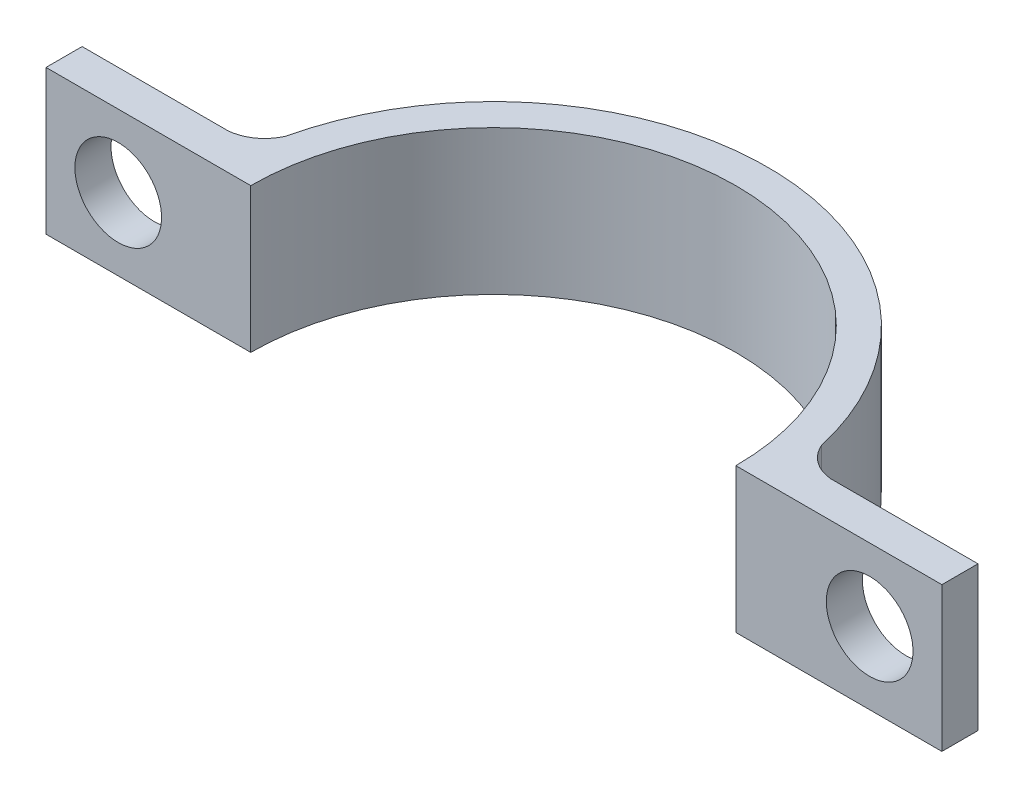
ISO-10303-21;
HEADER;
FILE_DESCRIPTION(('STEP AP214'),'2;1');
FILE_NAME('part.step','',(''),(''),'','','');
FILE_SCHEMA(('AUTOMOTIVE_DESIGN { 1 0 10303 214 1 1 1 1 }'));
ENDSEC;
DATA;
#1=APPLICATION_CONTEXT('core data for automotive mechanical design processes');
#2=APPLICATION_PROTOCOL_DEFINITION('international standard','automotive_design',2000,#1);
#3=PRODUCT_CONTEXT('',#1,'mechanical');
#4=PRODUCT('Part','Part','',(#3));
#5=PRODUCT_RELATED_PRODUCT_CATEGORY('part','',(#4));
#6=PRODUCT_DEFINITION_FORMATION('','',#4);
#7=PRODUCT_DEFINITION_CONTEXT('part definition',#1,'design');
#8=PRODUCT_DEFINITION('design','',#6,#7);
#9=PRODUCT_DEFINITION_SHAPE('','',#8);
#10=(LENGTH_UNIT() NAMED_UNIT(*) SI_UNIT(.MILLI.,.METRE.));
#11=(NAMED_UNIT(*) PLANE_ANGLE_UNIT() SI_UNIT($,.RADIAN.));
#12=(NAMED_UNIT(*) SI_UNIT($,.STERADIAN.) SOLID_ANGLE_UNIT());
#13=UNCERTAINTY_MEASURE_WITH_UNIT(LENGTH_MEASURE(1.E-05),#10,'distance_accuracy_value','');
#14=(GEOMETRIC_REPRESENTATION_CONTEXT(3) GLOBAL_UNCERTAINTY_ASSIGNED_CONTEXT((#13)) GLOBAL_UNIT_ASSIGNED_CONTEXT((#10,
#11,#12)) REPRESENTATION_CONTEXT('',''));
#15=CARTESIAN_POINT('',(0.,0.,0.));
#16=DIRECTION('',(0.,0.,1.));
#17=DIRECTION('',(1.,0.,0.));
#18=AXIS2_PLACEMENT_3D('',#15,#16,#17);
#19=CARTESIAN_POINT('',(22.902925638261,10.,4.77298113684332));
#20=DIRECTION('',(0.,-1.,0.));
#21=DIRECTION('',(0.,0.,-1.));
#22=AXIS2_PLACEMENT_3D('',#19,#20,#21);
#23=CYLINDRICAL_SURFACE('',#22,2.79217939644481);
#24=CARTESIAN_POINT('',(22.902925638261,0.,4.77298113684332));
#25=DIRECTION('',(0.,-1.,0.));
#26=DIRECTION('',(0.,0.,-1.));
#27=AXIS2_PLACEMENT_3D('',#24,#25,#26);
#28=CIRCLE('',#27,2.79217939644481);
#29=CARTESIAN_POINT('',(22.6391724501942,0.,7.5526753714158));
#30=VERTEX_POINT('',#29);
#31=CARTESIAN_POINT('',(20.3264501634081,0.,5.84910376434103));
#32=VERTEX_POINT('',#31);
#33=EDGE_CURVE('E142',#30,#32,#28,.T.);
#34=ORIENTED_EDGE('',*,*,#33,.T.);
#35=DIRECTION('',(0.,-1.,0.));
#36=VECTOR('',#35,1.);
#37=CARTESIAN_POINT('',(20.3264501634081,10.,5.84910376434103));
#38=LINE('',#37,#36);
#39=CARTESIAN_POINT('',(20.3264501634081,10.,5.84910376434103));
#40=VERTEX_POINT('',#39);
#41=EDGE_CURVE('E11',#40,#32,#38,.T.);
#42=ORIENTED_EDGE('',*,*,#41,.F.);
#43=CARTESIAN_POINT('',(22.902925638261,10.,4.77298113684332));
#44=DIRECTION('',(0.,-1.,0.));
#45=DIRECTION('',(0.,0.,-1.));
#46=AXIS2_PLACEMENT_3D('',#43,#44,#45);
#47=CIRCLE('',#46,2.79217939644481);
#48=CARTESIAN_POINT('',(22.6391724501942,10.,7.5526753714158));
#49=VERTEX_POINT('',#48);
#50=EDGE_CURVE('E160',#49,#40,#47,.T.);
#51=ORIENTED_EDGE('',*,*,#50,.F.);
#52=DIRECTION('',(0.,-1.,0.));
#53=VECTOR('',#52,1.);
#54=CARTESIAN_POINT('',(22.6391724501942,10.,7.5526753714158));
#55=LINE('',#54,#53);
#56=EDGE_CURVE('E138',#49,#30,#55,.T.);
#57=ORIENTED_EDGE('',*,*,#56,.T.);
#58=EDGE_LOOP('',(#34,#42,#51,#57));
#59=FACE_BOUND('',#58,.T.);
#60=ADVANCED_FACE('F33',(#59),#23,.F.);
#61=CARTESIAN_POINT('',(1.79728434990767,10.,10.0526753714158));
#62=DIRECTION('',(0.,-1.,0.));
#63=DIRECTION('',(0.,0.,-1.));
#64=AXIS2_PLACEMENT_3D('',#61,#62,#63);
#65=CYLINDRICAL_SURFACE('',#64,19.);
#66=CARTESIAN_POINT('',(1.79728434990767,0.,10.0526753714158));
#67=DIRECTION('',(0.,1.,0.));
#68=DIRECTION('',(0.,0.,1.));
#69=AXIS2_PLACEMENT_3D('',#66,#67,#68);
#70=CIRCLE('',#69,19.);
#71=CARTESIAN_POINT('',(-16.7318814635928,0.,5.849103764341));
#72=VERTEX_POINT('',#71);
#73=EDGE_CURVE('E145',#32,#72,#70,.T.);
#74=ORIENTED_EDGE('',*,*,#73,.T.);
#75=DIRECTION('',(0.,-1.,0.));
#76=VECTOR('',#75,1.);
#77=CARTESIAN_POINT('',(-16.7318814635928,10.,5.849103764341));
#78=LINE('',#77,#76);
#79=CARTESIAN_POINT('',(-16.7318814635928,10.,5.849103764341));
#80=VERTEX_POINT('',#79);
#81=EDGE_CURVE('E42',#80,#72,#78,.T.);
#82=ORIENTED_EDGE('',*,*,#81,.F.);
#83=CARTESIAN_POINT('',(1.79728434990767,10.,10.0526753714158));
#84=DIRECTION('',(0.,1.,0.));
#85=DIRECTION('',(0.,0.,1.));
#86=AXIS2_PLACEMENT_3D('',#83,#84,#85);
#87=CIRCLE('',#86,19.);
#88=EDGE_CURVE('E99',#40,#80,#87,.T.);
#89=ORIENTED_EDGE('',*,*,#88,.F.);
#90=ORIENTED_EDGE('',*,*,#41,.T.);
#91=EDGE_LOOP('',(#74,#82,#89,#90));
#92=FACE_BOUND('',#91,.T.);
#93=ADVANCED_FACE('F229',(#92),#65,.T.);
#94=CARTESIAN_POINT('',(-19.3083569384457,10.,4.77298113684332));
#95=DIRECTION('',(0.,-1.,0.));
#96=DIRECTION('',(0.,0.,-1.));
#97=AXIS2_PLACEMENT_3D('',#94,#95,#96);
#98=CYLINDRICAL_SURFACE('',#97,2.7921793964448);
#99=CARTESIAN_POINT('',(-19.3083569384457,0.,4.77298113684332));
#100=DIRECTION('',(0.,-1.,0.));
#101=DIRECTION('',(0.,0.,1.));
#102=AXIS2_PLACEMENT_3D('',#99,#100,#101);
#103=CIRCLE('',#102,2.7921793964448);
#104=CARTESIAN_POINT('',(-19.0446037503788,0.,7.55267537141579));
#105=VERTEX_POINT('',#104);
#106=EDGE_CURVE('E147',#72,#105,#103,.T.);
#107=ORIENTED_EDGE('',*,*,#106,.T.);
#108=DIRECTION('',(0.,-1.,0.));
#109=VECTOR('',#108,1.);
#110=CARTESIAN_POINT('',(-19.0446037503788,10.,7.55267537141579));
#111=LINE('',#110,#109);
#112=CARTESIAN_POINT('',(-19.0446037503788,10.,7.55267537141579));
#113=VERTEX_POINT('',#112);
#114=EDGE_CURVE('E173',#113,#105,#111,.T.);
#115=ORIENTED_EDGE('',*,*,#114,.F.);
#116=CARTESIAN_POINT('',(-19.3083569384457,10.,4.77298113684332));
#117=DIRECTION('',(0.,-1.,0.));
#118=DIRECTION('',(0.,0.,1.));
#119=AXIS2_PLACEMENT_3D('',#116,#117,#118);
#120=CIRCLE('',#119,2.7921793964448);
#121=EDGE_CURVE('E182',#80,#113,#120,.T.);
#122=ORIENTED_EDGE('',*,*,#121,.F.);
#123=ORIENTED_EDGE('',*,*,#81,.T.);
#124=EDGE_LOOP('',(#107,#115,#122,#123));
#125=FACE_BOUND('',#124,.T.);
#126=ADVANCED_FACE('F180',(#125),#98,.F.);
#127=CARTESIAN_POINT('',(-19.0446037503788,10.,7.5526753714158));
#128=DIRECTION('',(0.,0.,1.));
#129=DIRECTION('',(1.,0.,0.));
#130=AXIS2_PLACEMENT_3D('',#127,#128,#129);
#131=PLANE('',#130);
#132=CARTESIAN_POINT('',(-24.1654442066561,5.,7.5526753714158));
#133=DIRECTION('',(0.,0.,-1.));
#134=DIRECTION('',(-1.,0.,0.));
#135=AXIS2_PLACEMENT_3D('',#132,#133,#134);
#136=CIRCLE('',#135,3.);
#137=CARTESIAN_POINT('',(-27.1654442066561,5.,7.5526753714158));
#138=VERTEX_POINT('',#137);
#139=EDGE_CURVE('E211',#138,#138,#136,.T.);
#140=ORIENTED_EDGE('',*,*,#139,.F.);
#141=EDGE_LOOP('',(#140));
#142=FACE_BOUND('',#141,.T.);
#143=DIRECTION('',(-1.,0.,0.));
#144=VECTOR('',#143,1.);
#145=CARTESIAN_POINT('',(-19.0446037503788,0.,7.5526753714158));
#146=LINE('',#145,#144);
#147=CARTESIAN_POINT('',(-29.1654442066561,0.,7.5526753714158));
#148=VERTEX_POINT('',#147);
#149=EDGE_CURVE('E149',#105,#148,#146,.T.);
#150=ORIENTED_EDGE('',*,*,#149,.T.);
#151=DIRECTION('',(0.,-1.,0.));
#152=VECTOR('',#151,1.);
#153=CARTESIAN_POINT('',(-29.1654442066561,10.,7.5526753714158));
#154=LINE('',#153,#152);
#155=CARTESIAN_POINT('',(-29.1654442066561,10.,7.5526753714158));
#156=VERTEX_POINT('',#155);
#157=EDGE_CURVE('E170',#156,#148,#154,.T.);
#158=ORIENTED_EDGE('',*,*,#157,.F.);
#159=DIRECTION('',(-1.,0.,0.));
#160=VECTOR('',#159,1.);
#161=CARTESIAN_POINT('',(-19.0446037503788,10.,7.5526753714158));
#162=LINE('',#161,#160);
#163=EDGE_CURVE('E200',#113,#156,#162,.T.);
#164=ORIENTED_EDGE('',*,*,#163,.F.);
#165=ORIENTED_EDGE('',*,*,#114,.T.);
#166=EDGE_LOOP('',(#150,#158,#164,#165));
#167=FACE_BOUND('',#166,.T.);
#168=ADVANCED_FACE('F191',(#142,#167),#131,.F.);
#169=CARTESIAN_POINT('',(-29.1654442066561,10.,7.5526753714158));
#170=DIRECTION('',(1.,0.,0.));
#171=DIRECTION('',(0.,0.,-1.));
#172=AXIS2_PLACEMENT_3D('',#169,#170,#171);
#173=PLANE('',#172);
#174=DIRECTION('',(0.,0.,1.));
#175=VECTOR('',#174,1.);
#176=CARTESIAN_POINT('',(-29.1654442066561,0.,7.5526753714158));
#177=LINE('',#176,#175);
#178=CARTESIAN_POINT('',(-29.1654442066561,0.,10.0526753714158));
#179=VERTEX_POINT('',#178);
#180=EDGE_CURVE('E151',#148,#179,#177,.T.);
#181=ORIENTED_EDGE('',*,*,#180,.T.);
#182=DIRECTION('',(0.,-1.,0.));
#183=VECTOR('',#182,1.);
#184=CARTESIAN_POINT('',(-29.1654442066561,10.,10.0526753714158));
#185=LINE('',#184,#183);
#186=CARTESIAN_POINT('',(-29.1654442066561,10.,10.0526753714158));
#187=VERTEX_POINT('',#186);
#188=EDGE_CURVE('E167',#187,#179,#185,.T.);
#189=ORIENTED_EDGE('',*,*,#188,.F.);
#190=DIRECTION('',(0.,0.,1.));
#191=VECTOR('',#190,1.);
#192=CARTESIAN_POINT('',(-29.1654442066561,10.,7.5526753714158));
#193=LINE('',#192,#191);
#194=EDGE_CURVE('E197',#156,#187,#193,.T.);
#195=ORIENTED_EDGE('',*,*,#194,.F.);
#196=ORIENTED_EDGE('',*,*,#157,.T.);
#197=EDGE_LOOP('',(#181,#189,#195,#196));
#198=FACE_BOUND('',#197,.T.);
#199=ADVANCED_FACE('F195',(#198),#173,.F.);
#200=CARTESIAN_POINT('',(-14.9927156500923,10.,10.0526753714158));
#201=DIRECTION('',(0.,0.,-1.));
#202=DIRECTION('',(-1.,0.,0.));
#203=AXIS2_PLACEMENT_3D('',#200,#201,#202);
#204=PLANE('',#203);
#205=CARTESIAN_POINT('',(-24.1654442066561,5.,10.0526753714158));
#206=DIRECTION('',(0.,0.,-1.));
#207=DIRECTION('',(-1.,0.,0.));
#208=AXIS2_PLACEMENT_3D('',#205,#206,#207);
#209=CIRCLE('',#208,3.);
#210=CARTESIAN_POINT('',(-27.1654442066561,5.,10.0526753714158));
#211=VERTEX_POINT('',#210);
#212=EDGE_CURVE('E36',#211,#211,#209,.T.);
#213=ORIENTED_EDGE('',*,*,#212,.T.);
#214=EDGE_LOOP('',(#213));
#215=FACE_BOUND('',#214,.T.);
#216=DIRECTION('',(1.,0.,0.));
#217=VECTOR('',#216,1.);
#218=CARTESIAN_POINT('',(-14.9927156500923,0.,10.0526753714158));
#219=LINE('',#218,#217);
#220=CARTESIAN_POINT('',(-14.9927156500923,0.,10.0526753714158));
#221=VERTEX_POINT('',#220);
#222=EDGE_CURVE('E153',#179,#221,#219,.T.);
#223=ORIENTED_EDGE('',*,*,#222,.T.);
#224=DIRECTION('',(0.,-1.,0.));
#225=VECTOR('',#224,1.);
#226=CARTESIAN_POINT('',(-14.9927156500923,10.,10.0526753714158));
#227=LINE('',#226,#225);
#228=CARTESIAN_POINT('',(-14.9927156500923,10.,10.0526753714158));
#229=VERTEX_POINT('',#228);
#230=EDGE_CURVE('E164',#229,#221,#227,.T.);
#231=ORIENTED_EDGE('',*,*,#230,.F.);
#232=DIRECTION('',(1.,0.,0.));
#233=VECTOR('',#232,1.);
#234=CARTESIAN_POINT('',(-14.9927156500923,10.,10.0526753714158));
#235=LINE('',#234,#233);
#236=EDGE_CURVE('E199',#187,#229,#235,.T.);
#237=ORIENTED_EDGE('',*,*,#236,.F.);
#238=ORIENTED_EDGE('',*,*,#188,.T.);
#239=EDGE_LOOP('',(#223,#231,#237,#238));
#240=FACE_BOUND('',#239,.T.);
#241=ADVANCED_FACE('F227',(#215,#240),#204,.F.);
#242=CARTESIAN_POINT('',(1.79728434990767,10.,10.0526753714158));
#243=DIRECTION('',(0.,-1.,0.));
#244=DIRECTION('',(0.,0.,-1.));
#245=AXIS2_PLACEMENT_3D('',#242,#243,#244);
#246=CYLINDRICAL_SURFACE('',#245,16.79);
#247=CARTESIAN_POINT('',(1.79728434990767,0.,10.0526753714158));
#248=DIRECTION('',(0.,-1.,0.));
#249=DIRECTION('',(0.,0.,1.));
#250=AXIS2_PLACEMENT_3D('',#247,#248,#249);
#251=CIRCLE('',#250,16.79);
#252=CARTESIAN_POINT('',(18.5872843499077,0.,10.0526753714158));
#253=VERTEX_POINT('',#252);
#254=EDGE_CURVE('E155',#221,#253,#251,.T.);
#255=ORIENTED_EDGE('',*,*,#254,.T.);
#256=DIRECTION('',(0.,-1.,0.));
#257=VECTOR('',#256,1.);
#258=CARTESIAN_POINT('',(18.5872843499077,10.,10.0526753714158));
#259=LINE('',#258,#257);
#260=CARTESIAN_POINT('',(18.5872843499077,10.,10.0526753714158));
#261=VERTEX_POINT('',#260);
#262=EDGE_CURVE('E133',#261,#253,#259,.T.);
#263=ORIENTED_EDGE('',*,*,#262,.F.);
#264=CARTESIAN_POINT('',(1.79728434990767,10.,10.0526753714158));
#265=DIRECTION('',(0.,-1.,0.));
#266=DIRECTION('',(0.,0.,1.));
#267=AXIS2_PLACEMENT_3D('',#264,#265,#266);
#268=CIRCLE('',#267,16.79);
#269=EDGE_CURVE('E124',#229,#261,#268,.T.);
#270=ORIENTED_EDGE('',*,*,#269,.F.);
#271=ORIENTED_EDGE('',*,*,#230,.T.);
#272=EDGE_LOOP('',(#255,#263,#270,#271));
#273=FACE_BOUND('',#272,.T.);
#274=ADVANCED_FACE('F240',(#273),#246,.F.);
#275=CARTESIAN_POINT('',(18.5872843499077,10.,10.0526753714158));
#276=DIRECTION('',(0.,0.,-1.));
#277=DIRECTION('',(-1.,0.,0.));
#278=AXIS2_PLACEMENT_3D('',#275,#276,#277);
#279=PLANE('',#278);
#280=CARTESIAN_POINT('',(27.8499466827615,5.,10.0526753714158));
#281=DIRECTION('',(0.,0.,-1.));
#282=DIRECTION('',(-1.,0.,0.));
#283=AXIS2_PLACEMENT_3D('',#280,#281,#282);
#284=CIRCLE('',#283,3.);
#285=CARTESIAN_POINT('',(24.8499466827615,5.,10.0526753714158));
#286=VERTEX_POINT('',#285);
#287=EDGE_CURVE('E208',#286,#286,#284,.T.);
#288=ORIENTED_EDGE('',*,*,#287,.T.);
#289=EDGE_LOOP('',(#288));
#290=FACE_BOUND('',#289,.T.);
#291=DIRECTION('',(1.,0.,0.));
#292=VECTOR('',#291,1.);
#293=CARTESIAN_POINT('',(18.5872843499077,0.,10.0526753714158));
#294=LINE('',#293,#292);
#295=CARTESIAN_POINT('',(32.8499466827615,0.,10.0526753714158));
#296=VERTEX_POINT('',#295);
#297=EDGE_CURVE('E132',#253,#296,#294,.T.);
#298=ORIENTED_EDGE('',*,*,#297,.T.);
#299=DIRECTION('',(0.,-1.,0.));
#300=VECTOR('',#299,1.);
#301=CARTESIAN_POINT('',(32.8499466827615,10.,10.0526753714158));
#302=LINE('',#301,#300);
#303=CARTESIAN_POINT('',(32.8499466827615,10.,10.0526753714158));
#304=VERTEX_POINT('',#303);
#305=EDGE_CURVE('E129',#304,#296,#302,.T.);
#306=ORIENTED_EDGE('',*,*,#305,.F.);
#307=DIRECTION('',(1.,0.,0.));
#308=VECTOR('',#307,1.);
#309=CARTESIAN_POINT('',(18.5872843499077,10.,10.0526753714158));
#310=LINE('',#309,#308);
#311=EDGE_CURVE('E118',#261,#304,#310,.T.);
#312=ORIENTED_EDGE('',*,*,#311,.F.);
#313=ORIENTED_EDGE('',*,*,#262,.T.);
#314=EDGE_LOOP('',(#298,#306,#312,#313));
#315=FACE_BOUND('',#314,.T.);
#316=ADVANCED_FACE('F130',(#290,#315),#279,.F.);
#317=CARTESIAN_POINT('',(32.8499466827615,10.,7.5526753714158));
#318=DIRECTION('',(-1.,0.,0.));
#319=DIRECTION('',(0.,0.,1.));
#320=AXIS2_PLACEMENT_3D('',#317,#318,#319);
#321=PLANE('',#320);
#322=DIRECTION('',(0.,0.,-1.));
#323=VECTOR('',#322,1.);
#324=CARTESIAN_POINT('',(32.8499466827615,0.,7.5526753714158));
#325=LINE('',#324,#323);
#326=CARTESIAN_POINT('',(32.8499466827615,0.,7.5526753714158));
#327=VERTEX_POINT('',#326);
#328=EDGE_CURVE('E85',#296,#327,#325,.T.);
#329=ORIENTED_EDGE('',*,*,#328,.T.);
#330=DIRECTION('',(0.,-1.,0.));
#331=VECTOR('',#330,1.);
#332=CARTESIAN_POINT('',(32.8499466827615,10.,7.5526753714158));
#333=LINE('',#332,#331);
#334=CARTESIAN_POINT('',(32.8499466827615,10.,7.5526753714158));
#335=VERTEX_POINT('',#334);
#336=EDGE_CURVE('E134',#335,#327,#333,.T.);
#337=ORIENTED_EDGE('',*,*,#336,.F.);
#338=DIRECTION('',(0.,0.,-1.));
#339=VECTOR('',#338,1.);
#340=CARTESIAN_POINT('',(32.8499466827615,10.,7.5526753714158));
#341=LINE('',#340,#339);
#342=EDGE_CURVE('E122',#304,#335,#341,.T.);
#343=ORIENTED_EDGE('',*,*,#342,.F.);
#344=ORIENTED_EDGE('',*,*,#305,.T.);
#345=EDGE_LOOP('',(#329,#337,#343,#344));
#346=FACE_BOUND('',#345,.T.);
#347=ADVANCED_FACE('F136',(#346),#321,.F.);
#348=CARTESIAN_POINT('',(22.6391724501942,10.,7.5526753714158));
#349=DIRECTION('',(0.,0.,1.));
#350=DIRECTION('',(1.,0.,0.));
#351=AXIS2_PLACEMENT_3D('',#348,#349,#350);
#352=PLANE('',#351);
#353=CARTESIAN_POINT('',(27.8499466827615,5.,7.5526753714158));
#354=DIRECTION('',(0.,0.,-1.));
#355=DIRECTION('',(-1.,0.,0.));
#356=AXIS2_PLACEMENT_3D('',#353,#354,#355);
#357=CIRCLE('',#356,3.);
#358=CARTESIAN_POINT('',(24.8499466827615,5.,7.5526753714158));
#359=VERTEX_POINT('',#358);
#360=EDGE_CURVE('E212',#359,#359,#357,.T.);
#361=ORIENTED_EDGE('',*,*,#360,.F.);
#362=EDGE_LOOP('',(#361));
#363=FACE_BOUND('',#362,.T.);
#364=DIRECTION('',(-1.,0.,0.));
#365=VECTOR('',#364,1.);
#366=CARTESIAN_POINT('',(22.6391724501942,0.,7.5526753714158));
#367=LINE('',#366,#365);
#368=EDGE_CURVE('E91',#327,#30,#367,.T.);
#369=ORIENTED_EDGE('',*,*,#368,.T.);
#370=ORIENTED_EDGE('',*,*,#56,.F.);
#371=DIRECTION('',(-1.,0.,0.));
#372=VECTOR('',#371,1.);
#373=CARTESIAN_POINT('',(22.6391724501942,10.,7.5526753714158));
#374=LINE('',#373,#372);
#375=EDGE_CURVE('E50',#335,#49,#374,.T.);
#376=ORIENTED_EDGE('',*,*,#375,.F.);
#377=ORIENTED_EDGE('',*,*,#336,.T.);
#378=EDGE_LOOP('',(#369,#370,#376,#377));
#379=FACE_BOUND('',#378,.T.);
#380=ADVANCED_FACE('F257',(#363,#379),#352,.F.);
#381=CARTESIAN_POINT('',(22.902925638261,10.,4.77298113684332));
#382=DIRECTION('',(0.,-1.,0.));
#383=DIRECTION('',(0.,0.,-1.));
#384=AXIS2_PLACEMENT_3D('',#381,#382,#383);
#385=PLANE('',#384);
#386=ORIENTED_EDGE('',*,*,#50,.T.);
#387=ORIENTED_EDGE('',*,*,#88,.T.);
#388=ORIENTED_EDGE('',*,*,#121,.T.);
#389=ORIENTED_EDGE('',*,*,#163,.T.);
#390=ORIENTED_EDGE('',*,*,#194,.T.);
#391=ORIENTED_EDGE('',*,*,#236,.T.);
#392=ORIENTED_EDGE('',*,*,#269,.T.);
#393=ORIENTED_EDGE('',*,*,#311,.T.);
#394=ORIENTED_EDGE('',*,*,#342,.T.);
#395=ORIENTED_EDGE('',*,*,#375,.T.);
#396=EDGE_LOOP('',(#386,#387,#388,#389,#390,#391,#392,#393,#394,#395));
#397=FACE_BOUND('',#396,.T.);
#398=ADVANCED_FACE('F120',(#397),#385,.F.);
#399=CARTESIAN_POINT('',(22.902925638261,0.,4.77298113684332));
#400=DIRECTION('',(0.,-1.,0.));
#401=DIRECTION('',(0.,0.,-1.));
#402=AXIS2_PLACEMENT_3D('',#399,#400,#401);
#403=PLANE('',#402);
#404=ORIENTED_EDGE('',*,*,#33,.F.);
#405=ORIENTED_EDGE('',*,*,#368,.F.);
#406=ORIENTED_EDGE('',*,*,#328,.F.);
#407=ORIENTED_EDGE('',*,*,#297,.F.);
#408=ORIENTED_EDGE('',*,*,#254,.F.);
#409=ORIENTED_EDGE('',*,*,#222,.F.);
#410=ORIENTED_EDGE('',*,*,#180,.F.);
#411=ORIENTED_EDGE('',*,*,#149,.F.);
#412=ORIENTED_EDGE('',*,*,#106,.F.);
#413=ORIENTED_EDGE('',*,*,#73,.F.);
#414=EDGE_LOOP('',(#404,#405,#406,#407,#408,#409,#410,#411,#412,#413));
#415=FACE_BOUND('',#414,.T.);
#416=ADVANCED_FACE('F186',(#415),#403,.T.);
#417=CARTESIAN_POINT('',(27.8499466827615,5.,15.5526753714158));
#418=DIRECTION('',(0.,0.,-1.));
#419=DIRECTION('',(-1.,0.,0.));
#420=AXIS2_PLACEMENT_3D('',#417,#418,#419);
#421=CYLINDRICAL_SURFACE('',#420,3.);
#422=ORIENTED_EDGE('',*,*,#360,.T.);
#423=EDGE_LOOP('',(#422));
#424=FACE_BOUND('',#423,.T.);
#425=ORIENTED_EDGE('',*,*,#287,.F.);
#426=EDGE_LOOP('',(#425));
#427=FACE_BOUND('',#426,.T.);
#428=ADVANCED_FACE('F263',(#424,#427),#421,.F.);
#429=CARTESIAN_POINT('',(-24.1654442066561,5.,15.5526753714158));
#430=DIRECTION('',(0.,0.,-1.));
#431=DIRECTION('',(-1.,0.,0.));
#432=AXIS2_PLACEMENT_3D('',#429,#430,#431);
#433=CYLINDRICAL_SURFACE('',#432,3.);
#434=ORIENTED_EDGE('',*,*,#139,.T.);
#435=EDGE_LOOP('',(#434));
#436=FACE_BOUND('',#435,.T.);
#437=ORIENTED_EDGE('',*,*,#212,.F.);
#438=EDGE_LOOP('',(#437));
#439=FACE_BOUND('',#438,.T.);
#440=ADVANCED_FACE('F218',(#436,#439),#433,.F.);
#441=CLOSED_SHELL('',(#60,#93,#126,#168,#199,#241,#274,#316,#347,#380,#398,#416,#428,#440));
#442=MANIFOLD_SOLID_BREP('B2',#441);
#443=ADVANCED_BREP_SHAPE_REPRESENTATION('',(#18,#442),#14);
#444=SHAPE_DEFINITION_REPRESENTATION(#9,#443);
ENDSEC;
END-ISO-10303-21;
